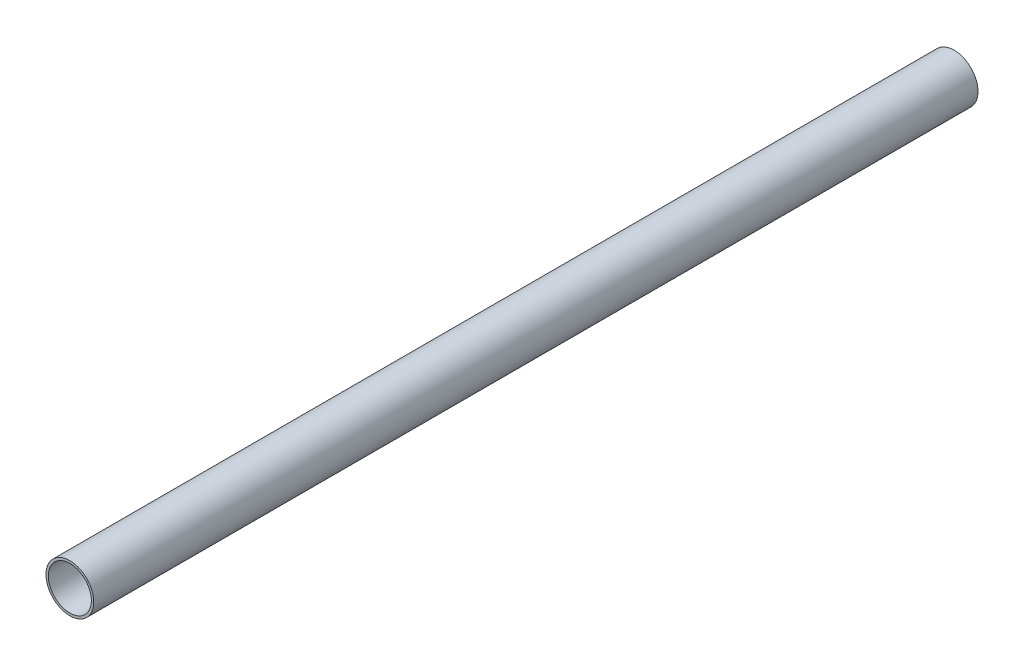
ISO-10303-21;
HEADER;
FILE_DESCRIPTION(('STEP AP214'),'2;1');
FILE_NAME('part.step','',(''),(''),'','','');
FILE_SCHEMA(('AUTOMOTIVE_DESIGN { 1 0 10303 214 1 1 1 1 }'));
ENDSEC;
DATA;
#1=APPLICATION_CONTEXT('core data for automotive mechanical design processes');
#2=APPLICATION_PROTOCOL_DEFINITION('international standard','automotive_design',2000,#1);
#3=PRODUCT_CONTEXT('',#1,'mechanical');
#4=PRODUCT('Part','Part','',(#3));
#5=PRODUCT_RELATED_PRODUCT_CATEGORY('part','',(#4));
#6=PRODUCT_DEFINITION_FORMATION('','',#4);
#7=PRODUCT_DEFINITION_CONTEXT('part definition',#1,'design');
#8=PRODUCT_DEFINITION('design','',#6,#7);
#9=PRODUCT_DEFINITION_SHAPE('','',#8);
#10=(LENGTH_UNIT() NAMED_UNIT(*) SI_UNIT(.MILLI.,.METRE.));
#11=(NAMED_UNIT(*) PLANE_ANGLE_UNIT() SI_UNIT($,.RADIAN.));
#12=(NAMED_UNIT(*) SI_UNIT($,.STERADIAN.) SOLID_ANGLE_UNIT());
#13=UNCERTAINTY_MEASURE_WITH_UNIT(LENGTH_MEASURE(1.E-05),#10,'distance_accuracy_value','');
#14=(GEOMETRIC_REPRESENTATION_CONTEXT(3) GLOBAL_UNCERTAINTY_ASSIGNED_CONTEXT((#13)) GLOBAL_UNIT_ASSIGNED_CONTEXT((#10,
#11,#12)) REPRESENTATION_CONTEXT('',''));
#15=CARTESIAN_POINT('',(0.,0.,0.));
#16=DIRECTION('',(0.,0.,1.));
#17=DIRECTION('',(1.,0.,0.));
#18=AXIS2_PLACEMENT_3D('',#15,#16,#17);
#19=CARTESIAN_POINT('',(0.,0.,370.));
#20=DIRECTION('',(0.,0.,1.));
#21=DIRECTION('',(1.,0.,0.));
#22=AXIS2_PLACEMENT_3D('',#19,#20,#21);
#23=PLANE('',#22);
#24=CARTESIAN_POINT('',(0.,0.,370.));
#25=DIRECTION('',(0.,0.,1.));
#26=DIRECTION('',(1.,0.,0.));
#27=AXIS2_PLACEMENT_3D('',#24,#25,#26);
#28=CIRCLE('',#27,10.);
#29=CARTESIAN_POINT('',(10.,0.,370.));
#30=VERTEX_POINT('',#29);
#31=EDGE_CURVE('E10',#30,#30,#28,.T.);
#32=ORIENTED_EDGE('',*,*,#31,.T.);
#33=EDGE_LOOP('',(#32));
#34=FACE_BOUND('',#33,.T.);
#35=CARTESIAN_POINT('',(0.,0.,370.));
#36=DIRECTION('',(0.,0.,1.));
#37=DIRECTION('',(1.,0.,0.));
#38=AXIS2_PLACEMENT_3D('',#35,#36,#37);
#39=CIRCLE('',#38,9.);
#40=CARTESIAN_POINT('',(9.,0.,370.));
#41=VERTEX_POINT('',#40);
#42=EDGE_CURVE('E54',#41,#41,#39,.T.);
#43=ORIENTED_EDGE('',*,*,#42,.F.);
#44=EDGE_LOOP('',(#43));
#45=FACE_BOUND('',#44,.T.);
#46=ADVANCED_FACE('F41',(#34,#45),#23,.T.);
#47=CARTESIAN_POINT('',(0.,0.,0.));
#48=DIRECTION('',(0.,0.,1.));
#49=DIRECTION('',(1.,0.,0.));
#50=AXIS2_PLACEMENT_3D('',#47,#48,#49);
#51=PLANE('',#50);
#52=CARTESIAN_POINT('',(0.,0.,0.));
#53=DIRECTION('',(0.,0.,1.));
#54=DIRECTION('',(1.,0.,0.));
#55=AXIS2_PLACEMENT_3D('',#52,#53,#54);
#56=CIRCLE('',#55,10.);
#57=CARTESIAN_POINT('',(10.,0.,0.));
#58=VERTEX_POINT('',#57);
#59=EDGE_CURVE('E45',#58,#58,#56,.T.);
#60=ORIENTED_EDGE('',*,*,#59,.F.);
#61=EDGE_LOOP('',(#60));
#62=FACE_BOUND('',#61,.T.);
#63=CARTESIAN_POINT('',(0.,0.,0.));
#64=DIRECTION('',(0.,0.,1.));
#65=DIRECTION('',(1.,0.,0.));
#66=AXIS2_PLACEMENT_3D('',#63,#64,#65);
#67=CIRCLE('',#66,9.);
#68=CARTESIAN_POINT('',(9.,0.,0.));
#69=VERTEX_POINT('',#68);
#70=EDGE_CURVE('E56',#69,#69,#67,.T.);
#71=ORIENTED_EDGE('',*,*,#70,.T.);
#72=EDGE_LOOP('',(#71));
#73=FACE_BOUND('',#72,.T.);
#74=ADVANCED_FACE('F68',(#62,#73),#51,.F.);
#75=CARTESIAN_POINT('',(0.,0.,370.));
#76=DIRECTION('',(0.,0.,-1.));
#77=DIRECTION('',(-1.,0.,0.));
#78=AXIS2_PLACEMENT_3D('',#75,#76,#77);
#79=CYLINDRICAL_SURFACE('',#78,10.);
#80=ORIENTED_EDGE('',*,*,#31,.F.);
#81=EDGE_LOOP('',(#80));
#82=FACE_BOUND('',#81,.T.);
#83=ORIENTED_EDGE('',*,*,#59,.T.);
#84=EDGE_LOOP('',(#83));
#85=FACE_BOUND('',#84,.T.);
#86=ADVANCED_FACE('F43',(#82,#85),#79,.T.);
#87=CARTESIAN_POINT('',(0.,0.,370.));
#88=DIRECTION('',(0.,0.,-1.));
#89=DIRECTION('',(-1.,0.,0.));
#90=AXIS2_PLACEMENT_3D('',#87,#88,#89);
#91=CYLINDRICAL_SURFACE('',#90,9.);
#92=ORIENTED_EDGE('',*,*,#42,.T.);
#93=EDGE_LOOP('',(#92));
#94=FACE_BOUND('',#93,.T.);
#95=ORIENTED_EDGE('',*,*,#70,.F.);
#96=EDGE_LOOP('',(#95));
#97=FACE_BOUND('',#96,.T.);
#98=ADVANCED_FACE('F64',(#94,#97),#91,.F.);
#99=CLOSED_SHELL('',(#46,#74,#86,#98));
#100=MANIFOLD_SOLID_BREP('B2',#99);
#101=ADVANCED_BREP_SHAPE_REPRESENTATION('',(#18,#100),#14);
#102=SHAPE_DEFINITION_REPRESENTATION(#9,#101);
ENDSEC;
END-ISO-10303-21;
